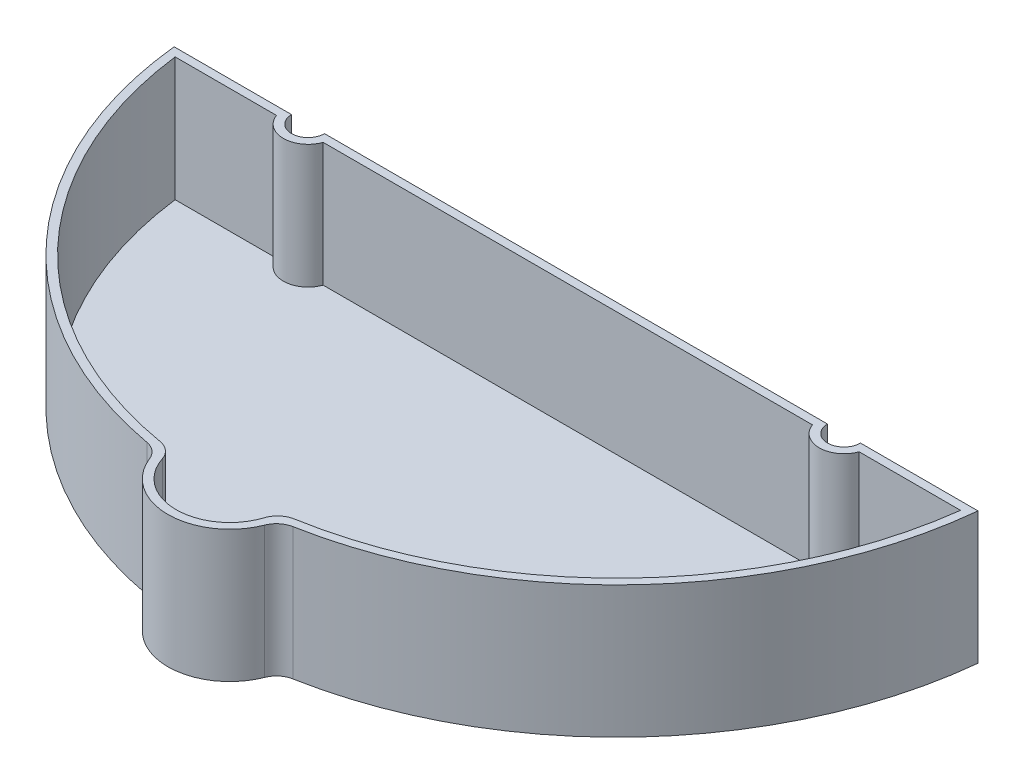
ISO-10303-21;
HEADER;
FILE_DESCRIPTION(('STEP AP214'),'2;1');
FILE_NAME('part.step','',(''),(''),'','','');
FILE_SCHEMA(('AUTOMOTIVE_DESIGN { 1 0 10303 214 1 1 1 1 }'));
ENDSEC;
DATA;
#1=APPLICATION_CONTEXT('core data for automotive mechanical design processes');
#2=APPLICATION_PROTOCOL_DEFINITION('international standard','automotive_design',2000,#1);
#3=PRODUCT_CONTEXT('',#1,'mechanical');
#4=PRODUCT('Part','Part','',(#3));
#5=PRODUCT_RELATED_PRODUCT_CATEGORY('part','',(#4));
#6=PRODUCT_DEFINITION_FORMATION('','',#4);
#7=PRODUCT_DEFINITION_CONTEXT('part definition',#1,'design');
#8=PRODUCT_DEFINITION('design','',#6,#7);
#9=PRODUCT_DEFINITION_SHAPE('','',#8);
#10=(LENGTH_UNIT() NAMED_UNIT(*) SI_UNIT(.MILLI.,.METRE.));
#11=(NAMED_UNIT(*) PLANE_ANGLE_UNIT() SI_UNIT($,.RADIAN.));
#12=(NAMED_UNIT(*) SI_UNIT($,.STERADIAN.) SOLID_ANGLE_UNIT());
#13=UNCERTAINTY_MEASURE_WITH_UNIT(LENGTH_MEASURE(1.E-05),#10,'distance_accuracy_value','');
#14=(GEOMETRIC_REPRESENTATION_CONTEXT(3) GLOBAL_UNCERTAINTY_ASSIGNED_CONTEXT((#13)) GLOBAL_UNIT_ASSIGNED_CONTEXT((#10,
#11,#12)) REPRESENTATION_CONTEXT('',''));
#15=CARTESIAN_POINT('',(0.,0.,0.));
#16=DIRECTION('',(0.,0.,1.));
#17=DIRECTION('',(1.,0.,0.));
#18=AXIS2_PLACEMENT_3D('',#15,#16,#17);
#19=CARTESIAN_POINT('',(65.,30.,-50.));
#20=DIRECTION('',(0.,-1.,0.));
#21=DIRECTION('',(0.,0.,-1.));
#22=AXIS2_PLACEMENT_3D('',#19,#20,#21);
#23=PLANE('',#22);
#24=CARTESIAN_POINT('',(65.,30.,-50.));
#25=DIRECTION('',(0.,-1.,0.));
#26=DIRECTION('',(0.,0.,-1.));
#27=AXIS2_PLACEMENT_3D('',#24,#25,#26);
#28=CIRCLE('',#27,4.);
#29=CARTESIAN_POINT('',(69.,30.,-50.));
#30=VERTEX_POINT('',#29);
#31=CARTESIAN_POINT('',(61.,30.,-50.));
#32=VERTEX_POINT('',#31);
#33=EDGE_CURVE('E232',#30,#32,#28,.T.);
#34=ORIENTED_EDGE('',*,*,#33,.T.);
#35=DIRECTION('',(-1.,0.,0.));
#36=VECTOR('',#35,1.);
#37=CARTESIAN_POINT('',(7.5,30.,-50.));
#38=LINE('',#37,#36);
#39=CARTESIAN_POINT('',(-61.,30.,-50.));
#40=VERTEX_POINT('',#39);
#41=EDGE_CURVE('E235',#32,#40,#38,.T.);
#42=ORIENTED_EDGE('',*,*,#41,.T.);
#43=CARTESIAN_POINT('',(-65.,30.,-50.));
#44=DIRECTION('',(0.,-1.,0.));
#45=DIRECTION('',(0.,0.,1.));
#46=AXIS2_PLACEMENT_3D('',#43,#44,#45);
#47=CIRCLE('',#46,4.);
#48=CARTESIAN_POINT('',(-69.,30.,-50.));
#49=VERTEX_POINT('',#48);
#50=EDGE_CURVE('E238',#40,#49,#47,.T.);
#51=ORIENTED_EDGE('',*,*,#50,.T.);
#52=DIRECTION('',(-1.,0.,0.));
#53=VECTOR('',#52,1.);
#54=CARTESIAN_POINT('',(-97.4884608556315,30.,-50.));
#55=LINE('',#54,#53);
#56=CARTESIAN_POINT('',(-97.4884608556315,30.,-50.));
#57=VERTEX_POINT('',#56);
#58=EDGE_CURVE('E240',#49,#57,#55,.T.);
#59=ORIENTED_EDGE('',*,*,#58,.T.);
#60=CARTESIAN_POINT('',(0.,30.,-60.));
#61=DIRECTION('',(0.,1.,0.));
#62=DIRECTION('',(0.,0.,1.));
#63=AXIS2_PLACEMENT_3D('',#60,#61,#62);
#64=CIRCLE('',#63,98.);
#65=CARTESIAN_POINT('',(-17.7150688006429,30.,36.3855608345383));
#66=VERTEX_POINT('',#65);
#67=EDGE_CURVE('E242',#57,#66,#64,.T.);
#68=ORIENTED_EDGE('',*,*,#67,.T.);
#69=CARTESIAN_POINT('',(-18.6188988414921,30.,41.3031914893617));
#70=DIRECTION('',(0.,-1.,0.));
#71=DIRECTION('',(0.,0.,-1.));
#72=AXIS2_PLACEMENT_3D('',#69,#70,#71);
#73=CIRCLE('',#72,5.);
#74=CARTESIAN_POINT('',(-13.9641741311191,30.,39.4773936170213));
#75=VERTEX_POINT('',#74);
#76=EDGE_CURVE('E11',#66,#75,#73,.T.);
#77=ORIENTED_EDGE('',*,*,#76,.T.);
#78=CARTESIAN_POINT('',(0.,30.,34.));
#79=DIRECTION('',(0.,1.,0.));
#80=DIRECTION('',(0.,0.,1.));
#81=AXIS2_PLACEMENT_3D('',#78,#79,#80);
#82=CIRCLE('',#81,15.);
#83=CARTESIAN_POINT('',(13.9641741311191,30.,39.4773936170213));
#84=VERTEX_POINT('',#83);
#85=EDGE_CURVE('E245',#75,#84,#82,.T.);
#86=ORIENTED_EDGE('',*,*,#85,.T.);
#87=CARTESIAN_POINT('',(18.6188988414921,30.,41.3031914893617));
#88=DIRECTION('',(0.,-1.,0.));
#89=DIRECTION('',(0.,0.,-1.));
#90=AXIS2_PLACEMENT_3D('',#87,#88,#89);
#91=CIRCLE('',#90,5.);
#92=CARTESIAN_POINT('',(17.715068800643,30.,36.3855608345383));
#93=VERTEX_POINT('',#92);
#94=EDGE_CURVE('E315',#84,#93,#91,.T.);
#95=ORIENTED_EDGE('',*,*,#94,.T.);
#96=CARTESIAN_POINT('',(0.,30.,-60.));
#97=DIRECTION('',(0.,1.,0.));
#98=DIRECTION('',(0.,0.,1.));
#99=AXIS2_PLACEMENT_3D('',#96,#97,#98);
#100=CIRCLE('',#99,98.);
#101=CARTESIAN_POINT('',(97.4884608556315,30.,-50.));
#102=VERTEX_POINT('',#101);
#103=EDGE_CURVE('E248',#93,#102,#100,.T.);
#104=ORIENTED_EDGE('',*,*,#103,.T.);
#105=DIRECTION('',(-1.,0.,0.));
#106=VECTOR('',#105,1.);
#107=CARTESIAN_POINT('',(69.,30.,-50.));
#108=LINE('',#107,#106);
#109=EDGE_CURVE('E250',#102,#30,#108,.T.);
#110=ORIENTED_EDGE('',*,*,#109,.T.);
#111=EDGE_LOOP('',(#34,#42,#51,#59,#68,#77,#86,#95,#104,#110));
#112=FACE_BOUND('',#111,.T.);
#113=CARTESIAN_POINT('',(0.,30.,-60.));
#114=DIRECTION('',(0.,-1.,0.));
#115=DIRECTION('',(0.,0.,-1.));
#116=AXIS2_PLACEMENT_3D('',#113,#114,#115);
#117=CIRCLE('',#116,96.);
#118=CARTESIAN_POINT('',(16.2792649615235,30.,34.6096481988624));
#119=VERTEX_POINT('',#118);
#120=CARTESIAN_POINT('',(95.2470471983253,30.,-48.));
#121=VERTEX_POINT('',#120);
#122=EDGE_CURVE('E228',#119,#121,#117,.F.);
#123=ORIENTED_EDGE('',*,*,#122,.F.);
#124=CARTESIAN_POINT('',(17.1271433449361,30.,39.5372340425532));
#125=DIRECTION('',(0.,-1.,0.));
#126=DIRECTION('',(0.,0.,-1.));
#127=AXIS2_PLACEMENT_3D('',#124,#125,#126);
#128=CIRCLE('',#127,5.);
#129=CARTESIAN_POINT('',(12.3696035268983,30.,37.9991134751773));
#130=VERTEX_POINT('',#129);
#131=EDGE_CURVE('E295',#119,#130,#128,.F.);
#132=ORIENTED_EDGE('',*,*,#131,.T.);
#133=CARTESIAN_POINT('',(0.,30.,34.));
#134=DIRECTION('',(0.,-1.,0.));
#135=DIRECTION('',(0.,0.,-1.));
#136=AXIS2_PLACEMENT_3D('',#133,#134,#135);
#137=CIRCLE('',#136,13.);
#138=CARTESIAN_POINT('',(-12.3696035268983,30.,37.9991134751773));
#139=VERTEX_POINT('',#138);
#140=EDGE_CURVE('E225',#139,#130,#137,.F.);
#141=ORIENTED_EDGE('',*,*,#140,.F.);
#142=CARTESIAN_POINT('',(-17.1271433449362,30.,39.5372340425532));
#143=DIRECTION('',(0.,-1.,0.));
#144=DIRECTION('',(0.,0.,-1.));
#145=AXIS2_PLACEMENT_3D('',#142,#143,#144);
#146=CIRCLE('',#145,5.);
#147=CARTESIAN_POINT('',(-16.2792649615235,30.,34.6096481988624));
#148=VERTEX_POINT('',#147);
#149=EDGE_CURVE('E293',#139,#148,#146,.F.);
#150=ORIENTED_EDGE('',*,*,#149,.T.);
#151=CARTESIAN_POINT('',(0.,30.,-60.));
#152=DIRECTION('',(0.,-1.,0.));
#153=DIRECTION('',(0.,0.,-1.));
#154=AXIS2_PLACEMENT_3D('',#151,#152,#153);
#155=CIRCLE('',#154,96.);
#156=CARTESIAN_POINT('',(-95.2470471983253,30.,-48.));
#157=VERTEX_POINT('',#156);
#158=EDGE_CURVE('E222',#157,#148,#155,.F.);
#159=ORIENTED_EDGE('',*,*,#158,.F.);
#160=DIRECTION('',(-1.,0.,0.));
#161=VECTOR('',#160,1.);
#162=CARTESIAN_POINT('',(65.,30.,-48.));
#163=LINE('',#162,#161);
#164=CARTESIAN_POINT('',(-70.6568542494924,30.,-48.));
#165=VERTEX_POINT('',#164);
#166=EDGE_CURVE('E220',#165,#157,#163,.T.);
#167=ORIENTED_EDGE('',*,*,#166,.F.);
#168=CARTESIAN_POINT('',(-65.,30.,-50.));
#169=DIRECTION('',(0.,-1.,0.));
#170=DIRECTION('',(0.,0.,-1.));
#171=AXIS2_PLACEMENT_3D('',#168,#169,#170);
#172=CIRCLE('',#171,6.);
#173=CARTESIAN_POINT('',(-59.3431457505076,30.,-48.));
#174=VERTEX_POINT('',#173);
#175=EDGE_CURVE('E218',#174,#165,#172,.T.);
#176=ORIENTED_EDGE('',*,*,#175,.F.);
#177=DIRECTION('',(-1.,0.,0.));
#178=VECTOR('',#177,1.);
#179=CARTESIAN_POINT('',(65.,30.,-48.));
#180=LINE('',#179,#178);
#181=CARTESIAN_POINT('',(59.3431457505076,30.,-48.));
#182=VERTEX_POINT('',#181);
#183=EDGE_CURVE('E184',#182,#174,#180,.T.);
#184=ORIENTED_EDGE('',*,*,#183,.F.);
#185=CARTESIAN_POINT('',(65.,30.,-50.));
#186=DIRECTION('',(0.,-1.,0.));
#187=DIRECTION('',(0.,0.,-1.));
#188=AXIS2_PLACEMENT_3D('',#185,#186,#187);
#189=CIRCLE('',#188,6.);
#190=CARTESIAN_POINT('',(70.6568542494924,30.,-48.));
#191=VERTEX_POINT('',#190);
#192=EDGE_CURVE('E215',#191,#182,#189,.T.);
#193=ORIENTED_EDGE('',*,*,#192,.F.);
#194=DIRECTION('',(-1.,0.,0.));
#195=VECTOR('',#194,1.);
#196=CARTESIAN_POINT('',(65.,30.,-48.));
#197=LINE('',#196,#195);
#198=EDGE_CURVE('E230',#121,#191,#197,.T.);
#199=ORIENTED_EDGE('',*,*,#198,.F.);
#200=EDGE_LOOP('',(#123,#132,#141,#150,#159,#167,#176,#184,#193,#199));
#201=FACE_BOUND('',#200,.T.);
#202=ADVANCED_FACE('F34',(#112,#201),#23,.F.);
#203=CARTESIAN_POINT('',(65.,30.,-50.));
#204=DIRECTION('',(0.,-1.,0.));
#205=DIRECTION('',(0.,0.,-1.));
#206=AXIS2_PLACEMENT_3D('',#203,#204,#205);
#207=CYLINDRICAL_SURFACE('',#206,4.);
#208=CARTESIAN_POINT('',(65.,-2.,-50.));
#209=DIRECTION('',(0.,-1.,0.));
#210=DIRECTION('',(0.,0.,-1.));
#211=AXIS2_PLACEMENT_3D('',#208,#209,#210);
#212=CIRCLE('',#211,4.);
#213=CARTESIAN_POINT('',(69.,-2.,-50.));
#214=VERTEX_POINT('',#213);
#215=CARTESIAN_POINT('',(61.,-2.,-50.));
#216=VERTEX_POINT('',#215);
#217=EDGE_CURVE('E253',#214,#216,#212,.T.);
#218=ORIENTED_EDGE('',*,*,#217,.T.);
#219=DIRECTION('',(0.,-1.,0.));
#220=VECTOR('',#219,1.);
#221=CARTESIAN_POINT('',(61.,30.,-50.));
#222=LINE('',#221,#220);
#223=EDGE_CURVE('E283',#32,#216,#222,.T.);
#224=ORIENTED_EDGE('',*,*,#223,.F.);
#225=ORIENTED_EDGE('',*,*,#33,.F.);
#226=DIRECTION('',(0.,-1.,0.));
#227=VECTOR('',#226,1.);
#228=CARTESIAN_POINT('',(69.,30.,-50.));
#229=LINE('',#228,#227);
#230=EDGE_CURVE('E252',#30,#214,#229,.T.);
#231=ORIENTED_EDGE('',*,*,#230,.T.);
#232=EDGE_LOOP('',(#218,#224,#225,#231));
#233=FACE_BOUND('',#232,.T.);
#234=ADVANCED_FACE('F349',(#233),#207,.F.);
#235=CARTESIAN_POINT('',(-61.,30.,-50.));
#236=DIRECTION('',(0.,0.,1.));
#237=DIRECTION('',(1.,0.,0.));
#238=AXIS2_PLACEMENT_3D('',#235,#236,#237);
#239=PLANE('',#238);
#240=DIRECTION('',(-1.,0.,0.));
#241=VECTOR('',#240,1.);
#242=CARTESIAN_POINT('',(-61.,-2.,-50.));
#243=LINE('',#242,#241);
#244=CARTESIAN_POINT('',(-61.,-2.,-50.));
#245=VERTEX_POINT('',#244);
#246=EDGE_CURVE('E256',#216,#245,#243,.T.);
#247=ORIENTED_EDGE('',*,*,#246,.T.);
#248=DIRECTION('',(0.,-1.,0.));
#249=VECTOR('',#248,1.);
#250=CARTESIAN_POINT('',(-61.,30.,-50.));
#251=LINE('',#250,#249);
#252=EDGE_CURVE('E280',#40,#245,#251,.T.);
#253=ORIENTED_EDGE('',*,*,#252,.F.);
#254=ORIENTED_EDGE('',*,*,#41,.F.);
#255=ORIENTED_EDGE('',*,*,#223,.T.);
#256=EDGE_LOOP('',(#247,#253,#254,#255));
#257=FACE_BOUND('',#256,.T.);
#258=ADVANCED_FACE('F353',(#257),#239,.F.);
#259=CARTESIAN_POINT('',(-65.,30.,-50.));
#260=DIRECTION('',(0.,-1.,0.));
#261=DIRECTION('',(0.,0.,-1.));
#262=AXIS2_PLACEMENT_3D('',#259,#260,#261);
#263=CYLINDRICAL_SURFACE('',#262,4.);
#264=CARTESIAN_POINT('',(-65.,-2.,-50.));
#265=DIRECTION('',(0.,-1.,0.));
#266=DIRECTION('',(0.,0.,1.));
#267=AXIS2_PLACEMENT_3D('',#264,#265,#266);
#268=CIRCLE('',#267,4.);
#269=CARTESIAN_POINT('',(-69.,-2.,-50.));
#270=VERTEX_POINT('',#269);
#271=EDGE_CURVE('E258',#245,#270,#268,.T.);
#272=ORIENTED_EDGE('',*,*,#271,.T.);
#273=DIRECTION('',(0.,-1.,0.));
#274=VECTOR('',#273,1.);
#275=CARTESIAN_POINT('',(-69.,30.,-50.));
#276=LINE('',#275,#274);
#277=EDGE_CURVE('E277',#49,#270,#276,.T.);
#278=ORIENTED_EDGE('',*,*,#277,.F.);
#279=ORIENTED_EDGE('',*,*,#50,.F.);
#280=ORIENTED_EDGE('',*,*,#252,.T.);
#281=EDGE_LOOP('',(#272,#278,#279,#280));
#282=FACE_BOUND('',#281,.T.);
#283=ADVANCED_FACE('F520',(#282),#263,.F.);
#284=CARTESIAN_POINT('',(-97.4884608556315,30.,-50.));
#285=DIRECTION('',(0.,0.,1.));
#286=DIRECTION('',(1.,0.,0.));
#287=AXIS2_PLACEMENT_3D('',#284,#285,#286);
#288=PLANE('',#287);
#289=DIRECTION('',(-1.,0.,0.));
#290=VECTOR('',#289,1.);
#291=CARTESIAN_POINT('',(-97.4884608556315,-2.,-50.));
#292=LINE('',#291,#290);
#293=CARTESIAN_POINT('',(-97.4884608556315,-2.,-50.));
#294=VERTEX_POINT('',#293);
#295=EDGE_CURVE('E260',#270,#294,#292,.T.);
#296=ORIENTED_EDGE('',*,*,#295,.T.);
#297=DIRECTION('',(0.,-1.,0.));
#298=VECTOR('',#297,1.);
#299=CARTESIAN_POINT('',(-97.4884608556315,30.,-50.));
#300=LINE('',#299,#298);
#301=EDGE_CURVE('E274',#57,#294,#300,.T.);
#302=ORIENTED_EDGE('',*,*,#301,.F.);
#303=ORIENTED_EDGE('',*,*,#58,.F.);
#304=ORIENTED_EDGE('',*,*,#277,.T.);
#305=EDGE_LOOP('',(#296,#302,#303,#304));
#306=FACE_BOUND('',#305,.T.);
#307=ADVANCED_FACE('F512',(#306),#288,.F.);
#308=CARTESIAN_POINT('',(0.,30.,-60.));
#309=DIRECTION('',(0.,-1.,0.));
#310=DIRECTION('',(0.,0.,-1.));
#311=AXIS2_PLACEMENT_3D('',#308,#309,#310);
#312=CYLINDRICAL_SURFACE('',#311,98.);
#313=CARTESIAN_POINT('',(0.,-2.,-60.));
#314=DIRECTION('',(0.,1.,0.));
#315=DIRECTION('',(0.,0.,1.));
#316=AXIS2_PLACEMENT_3D('',#313,#314,#315);
#317=CIRCLE('',#316,98.);
#318=CARTESIAN_POINT('',(-17.7150688006429,-2.,36.3855608345383));
#319=VERTEX_POINT('',#318);
#320=EDGE_CURVE('E262',#294,#319,#317,.T.);
#321=ORIENTED_EDGE('',*,*,#320,.T.);
#322=DIRECTION('',(0.,-1.,0.));
#323=VECTOR('',#322,1.);
#324=CARTESIAN_POINT('',(-17.7150688006429,30.,36.3855608345383));
#325=LINE('',#324,#323);
#326=EDGE_CURVE('E308',#319,#66,#325,.F.);
#327=ORIENTED_EDGE('',*,*,#326,.T.);
#328=ORIENTED_EDGE('',*,*,#67,.F.);
#329=ORIENTED_EDGE('',*,*,#301,.T.);
#330=EDGE_LOOP('',(#321,#327,#328,#329));
#331=FACE_BOUND('',#330,.T.);
#332=ADVANCED_FACE('F505',(#331),#312,.T.);
#333=CARTESIAN_POINT('',(0.,30.,34.));
#334=DIRECTION('',(0.,-1.,0.));
#335=DIRECTION('',(0.,0.,-1.));
#336=AXIS2_PLACEMENT_3D('',#333,#334,#335);
#337=CYLINDRICAL_SURFACE('',#336,15.);
#338=CARTESIAN_POINT('',(0.,-2.,34.));
#339=DIRECTION('',(0.,1.,0.));
#340=DIRECTION('',(0.,0.,1.));
#341=AXIS2_PLACEMENT_3D('',#338,#339,#340);
#342=CIRCLE('',#341,15.);
#343=CARTESIAN_POINT('',(-13.9641741311191,-2.,39.4773936170213));
#344=VERTEX_POINT('',#343);
#345=CARTESIAN_POINT('',(13.9641741311191,-2.,39.4773936170213));
#346=VERTEX_POINT('',#345);
#347=EDGE_CURVE('E264',#344,#346,#342,.T.);
#348=ORIENTED_EDGE('',*,*,#347,.T.);
#349=DIRECTION('',(0.,-1.,0.));
#350=VECTOR('',#349,1.);
#351=CARTESIAN_POINT('',(13.9641741311191,30.,39.4773936170213));
#352=LINE('',#351,#350);
#353=EDGE_CURVE('E306',#346,#84,#352,.F.);
#354=ORIENTED_EDGE('',*,*,#353,.T.);
#355=ORIENTED_EDGE('',*,*,#85,.F.);
#356=DIRECTION('',(0.,-1.,0.));
#357=VECTOR('',#356,1.);
#358=CARTESIAN_POINT('',(-13.9641741311191,30.,39.4773936170213));
#359=LINE('',#358,#357);
#360=EDGE_CURVE('E303',#75,#344,#359,.T.);
#361=ORIENTED_EDGE('',*,*,#360,.T.);
#362=EDGE_LOOP('',(#348,#354,#355,#361));
#363=FACE_BOUND('',#362,.T.);
#364=ADVANCED_FACE('F330',(#363),#337,.T.);
#365=CARTESIAN_POINT('',(0.,30.,-60.));
#366=DIRECTION('',(0.,-1.,0.));
#367=DIRECTION('',(0.,0.,-1.));
#368=AXIS2_PLACEMENT_3D('',#365,#366,#367);
#369=CYLINDRICAL_SURFACE('',#368,98.);
#370=ORIENTED_EDGE('',*,*,#103,.F.);
#371=DIRECTION('',(0.,-1.,0.));
#372=VECTOR('',#371,1.);
#373=CARTESIAN_POINT('',(17.715068800643,30.,36.3855608345383));
#374=LINE('',#373,#372);
#375=CARTESIAN_POINT('',(17.715068800643,-2.,36.3855608345383));
#376=VERTEX_POINT('',#375);
#377=EDGE_CURVE('E300',#93,#376,#374,.T.);
#378=ORIENTED_EDGE('',*,*,#377,.T.);
#379=CARTESIAN_POINT('',(0.,-2.,-60.));
#380=DIRECTION('',(0.,1.,0.));
#381=DIRECTION('',(0.,0.,1.));
#382=AXIS2_PLACEMENT_3D('',#379,#380,#381);
#383=CIRCLE('',#382,98.);
#384=CARTESIAN_POINT('',(97.4884608556315,-2.,-50.));
#385=VERTEX_POINT('',#384);
#386=EDGE_CURVE('E266',#376,#385,#383,.T.);
#387=ORIENTED_EDGE('',*,*,#386,.T.);
#388=DIRECTION('',(0.,-1.,0.));
#389=VECTOR('',#388,1.);
#390=CARTESIAN_POINT('',(97.4884608556315,30.,-50.));
#391=LINE('',#390,#389);
#392=EDGE_CURVE('E271',#102,#385,#391,.T.);
#393=ORIENTED_EDGE('',*,*,#392,.F.);
#394=EDGE_LOOP('',(#370,#378,#387,#393));
#395=FACE_BOUND('',#394,.T.);
#396=ADVANCED_FACE('F326',(#395),#369,.T.);
#397=CARTESIAN_POINT('',(69.,30.,-50.));
#398=DIRECTION('',(0.,0.,1.));
#399=DIRECTION('',(1.,0.,0.));
#400=AXIS2_PLACEMENT_3D('',#397,#398,#399);
#401=PLANE('',#400);
#402=DIRECTION('',(-1.,0.,0.));
#403=VECTOR('',#402,1.);
#404=CARTESIAN_POINT('',(69.,-2.,-50.));
#405=LINE('',#404,#403);
#406=EDGE_CURVE('E236',#385,#214,#405,.T.);
#407=ORIENTED_EDGE('',*,*,#406,.T.);
#408=ORIENTED_EDGE('',*,*,#230,.F.);
#409=ORIENTED_EDGE('',*,*,#109,.F.);
#410=ORIENTED_EDGE('',*,*,#392,.T.);
#411=EDGE_LOOP('',(#407,#408,#409,#410));
#412=FACE_BOUND('',#411,.T.);
#413=ADVANCED_FACE('F337',(#412),#401,.F.);
#414=CARTESIAN_POINT('',(65.,-2.,-50.));
#415=DIRECTION('',(0.,-1.,0.));
#416=DIRECTION('',(0.,0.,-1.));
#417=AXIS2_PLACEMENT_3D('',#414,#415,#416);
#418=PLANE('',#417);
#419=ORIENTED_EDGE('',*,*,#217,.F.);
#420=ORIENTED_EDGE('',*,*,#406,.F.);
#421=ORIENTED_EDGE('',*,*,#386,.F.);
#422=CARTESIAN_POINT('',(18.6188988414921,-2.,41.3031914893617));
#423=DIRECTION('',(0.,-1.,0.));
#424=DIRECTION('',(0.,0.,-1.));
#425=AXIS2_PLACEMENT_3D('',#422,#423,#424);
#426=CIRCLE('',#425,5.);
#427=EDGE_CURVE('E54',#376,#346,#426,.F.);
#428=ORIENTED_EDGE('',*,*,#427,.T.);
#429=ORIENTED_EDGE('',*,*,#347,.F.);
#430=CARTESIAN_POINT('',(-18.6188988414921,-2.,41.3031914893617));
#431=DIRECTION('',(0.,-1.,0.));
#432=DIRECTION('',(0.,0.,-1.));
#433=AXIS2_PLACEMENT_3D('',#430,#431,#432);
#434=CIRCLE('',#433,5.);
#435=EDGE_CURVE('E42',#344,#319,#434,.F.);
#436=ORIENTED_EDGE('',*,*,#435,.T.);
#437=ORIENTED_EDGE('',*,*,#320,.F.);
#438=ORIENTED_EDGE('',*,*,#295,.F.);
#439=ORIENTED_EDGE('',*,*,#271,.F.);
#440=ORIENTED_EDGE('',*,*,#246,.F.);
#441=EDGE_LOOP('',(#419,#420,#421,#428,#429,#436,#437,#438,#439,#440));
#442=FACE_BOUND('',#441,.T.);
#443=ADVANCED_FACE('F333',(#442),#418,.T.);
#444=CARTESIAN_POINT('',(65.,30.,-50.));
#445=DIRECTION('',(0.,-1.,0.));
#446=DIRECTION('',(0.,0.,-1.));
#447=AXIS2_PLACEMENT_3D('',#444,#445,#446);
#448=CYLINDRICAL_SURFACE('',#447,6.);
#449=CARTESIAN_POINT('',(65.,0.,-50.));
#450=DIRECTION('',(0.,-1.,0.));
#451=DIRECTION('',(0.,0.,-1.));
#452=AXIS2_PLACEMENT_3D('',#449,#450,#451);
#453=CIRCLE('',#452,6.);
#454=CARTESIAN_POINT('',(70.6568542494924,0.,-48.));
#455=VERTEX_POINT('',#454);
#456=CARTESIAN_POINT('',(59.3431457505076,0.,-48.));
#457=VERTEX_POINT('',#456);
#458=EDGE_CURVE('E175',#455,#457,#453,.T.);
#459=ORIENTED_EDGE('',*,*,#458,.F.);
#460=DIRECTION('',(0.,-1.,0.));
#461=VECTOR('',#460,1.);
#462=CARTESIAN_POINT('',(70.6568542494924,30.,-48.));
#463=LINE('',#462,#461);
#464=EDGE_CURVE('E213',#191,#455,#463,.T.);
#465=ORIENTED_EDGE('',*,*,#464,.F.);
#466=ORIENTED_EDGE('',*,*,#192,.T.);
#467=DIRECTION('',(0.,-1.,0.));
#468=VECTOR('',#467,1.);
#469=CARTESIAN_POINT('',(59.3431457505076,30.,-48.));
#470=LINE('',#469,#468);
#471=EDGE_CURVE('E187',#182,#457,#470,.T.);
#472=ORIENTED_EDGE('',*,*,#471,.T.);
#473=EDGE_LOOP('',(#459,#465,#466,#472));
#474=FACE_BOUND('',#473,.T.);
#475=ADVANCED_FACE('F336',(#474),#448,.T.);
#476=CARTESIAN_POINT('',(-61.,30.,-48.));
#477=DIRECTION('',(0.,0.,1.));
#478=DIRECTION('',(1.,0.,0.));
#479=AXIS2_PLACEMENT_3D('',#476,#477,#478);
#480=PLANE('',#479);
#481=DIRECTION('',(-1.,0.,0.));
#482=VECTOR('',#481,1.);
#483=CARTESIAN_POINT('',(65.,0.,-48.));
#484=LINE('',#483,#482);
#485=CARTESIAN_POINT('',(-59.3431457505076,0.,-48.));
#486=VERTEX_POINT('',#485);
#487=EDGE_CURVE('E168',#457,#486,#484,.T.);
#488=ORIENTED_EDGE('',*,*,#487,.F.);
#489=ORIENTED_EDGE('',*,*,#471,.F.);
#490=ORIENTED_EDGE('',*,*,#183,.T.);
#491=DIRECTION('',(0.,-1.,0.));
#492=VECTOR('',#491,1.);
#493=CARTESIAN_POINT('',(-59.3431457505076,30.,-48.));
#494=LINE('',#493,#492);
#495=EDGE_CURVE('E181',#174,#486,#494,.T.);
#496=ORIENTED_EDGE('',*,*,#495,.T.);
#497=EDGE_LOOP('',(#488,#489,#490,#496));
#498=FACE_BOUND('',#497,.T.);
#499=ADVANCED_FACE('F182',(#498),#480,.T.);
#500=CARTESIAN_POINT('',(-65.,30.,-50.));
#501=DIRECTION('',(0.,-1.,0.));
#502=DIRECTION('',(0.,0.,-1.));
#503=AXIS2_PLACEMENT_3D('',#500,#501,#502);
#504=CYLINDRICAL_SURFACE('',#503,6.);
#505=CARTESIAN_POINT('',(-65.,0.,-50.));
#506=DIRECTION('',(0.,-1.,0.));
#507=DIRECTION('',(0.,0.,-1.));
#508=AXIS2_PLACEMENT_3D('',#505,#506,#507);
#509=CIRCLE('',#508,6.);
#510=CARTESIAN_POINT('',(-70.6568542494924,0.,-48.));
#511=VERTEX_POINT('',#510);
#512=EDGE_CURVE('E172',#486,#511,#509,.T.);
#513=ORIENTED_EDGE('',*,*,#512,.F.);
#514=ORIENTED_EDGE('',*,*,#495,.F.);
#515=ORIENTED_EDGE('',*,*,#175,.T.);
#516=DIRECTION('',(0.,-1.,0.));
#517=VECTOR('',#516,1.);
#518=CARTESIAN_POINT('',(-70.6568542494924,30.,-48.));
#519=LINE('',#518,#517);
#520=EDGE_CURVE('E188',#165,#511,#519,.T.);
#521=ORIENTED_EDGE('',*,*,#520,.T.);
#522=EDGE_LOOP('',(#513,#514,#515,#521));
#523=FACE_BOUND('',#522,.T.);
#524=ADVANCED_FACE('F190',(#523),#504,.T.);
#525=CARTESIAN_POINT('',(-97.4884608556315,30.,-48.));
#526=DIRECTION('',(0.,0.,1.));
#527=DIRECTION('',(1.,0.,0.));
#528=AXIS2_PLACEMENT_3D('',#525,#526,#527);
#529=PLANE('',#528);
#530=DIRECTION('',(-1.,0.,0.));
#531=VECTOR('',#530,1.);
#532=CARTESIAN_POINT('',(65.,0.,-48.));
#533=LINE('',#532,#531);
#534=CARTESIAN_POINT('',(-95.2470471983253,0.,-48.));
#535=VERTEX_POINT('',#534);
#536=EDGE_CURVE('E193',#511,#535,#533,.T.);
#537=ORIENTED_EDGE('',*,*,#536,.F.);
#538=ORIENTED_EDGE('',*,*,#520,.F.);
#539=ORIENTED_EDGE('',*,*,#166,.T.);
#540=DIRECTION('',(0.,-1.,0.));
#541=VECTOR('',#540,1.);
#542=CARTESIAN_POINT('',(-95.2470471983253,30.,-48.));
#543=LINE('',#542,#541);
#544=EDGE_CURVE('E198',#157,#535,#543,.T.);
#545=ORIENTED_EDGE('',*,*,#544,.T.);
#546=EDGE_LOOP('',(#537,#538,#539,#545));
#547=FACE_BOUND('',#546,.T.);
#548=ADVANCED_FACE('F375',(#547),#529,.T.);
#549=CARTESIAN_POINT('',(0.,30.,-60.));
#550=DIRECTION('',(0.,-1.,0.));
#551=DIRECTION('',(0.,0.,-1.));
#552=AXIS2_PLACEMENT_3D('',#549,#550,#551);
#553=CYLINDRICAL_SURFACE('',#552,96.);
#554=ORIENTED_EDGE('',*,*,#158,.T.);
#555=DIRECTION('',(0.,-1.,0.));
#556=VECTOR('',#555,1.);
#557=CARTESIAN_POINT('',(-16.2792649615235,30.,34.6096481988624));
#558=LINE('',#557,#556);
#559=CARTESIAN_POINT('',(-16.2792649615235,0.,34.6096481988624));
#560=VERTEX_POINT('',#559);
#561=EDGE_CURVE('E297',#148,#560,#558,.T.);
#562=ORIENTED_EDGE('',*,*,#561,.T.);
#563=CARTESIAN_POINT('',(0.,0.,-60.));
#564=DIRECTION('',(0.,-1.,0.));
#565=DIRECTION('',(0.,0.,-1.));
#566=AXIS2_PLACEMENT_3D('',#563,#564,#565);
#567=CIRCLE('',#566,96.);
#568=EDGE_CURVE('E195',#535,#560,#567,.F.);
#569=ORIENTED_EDGE('',*,*,#568,.F.);
#570=ORIENTED_EDGE('',*,*,#544,.F.);
#571=EDGE_LOOP('',(#554,#562,#569,#570));
#572=FACE_BOUND('',#571,.T.);
#573=ADVANCED_FACE('F371',(#572),#553,.F.);
#574=CARTESIAN_POINT('',(0.,30.,34.));
#575=DIRECTION('',(0.,-1.,0.));
#576=DIRECTION('',(0.,0.,-1.));
#577=AXIS2_PLACEMENT_3D('',#574,#575,#576);
#578=CYLINDRICAL_SURFACE('',#577,13.);
#579=ORIENTED_EDGE('',*,*,#140,.T.);
#580=DIRECTION('',(0.,-1.,0.));
#581=VECTOR('',#580,1.);
#582=CARTESIAN_POINT('',(12.3696035268983,30.,37.9991134751773));
#583=LINE('',#582,#581);
#584=CARTESIAN_POINT('',(12.3696035268983,0.,37.9991134751773));
#585=VERTEX_POINT('',#584);
#586=EDGE_CURVE('E288',#130,#585,#583,.T.);
#587=ORIENTED_EDGE('',*,*,#586,.T.);
#588=CARTESIAN_POINT('',(0.,0.,34.));
#589=DIRECTION('',(0.,-1.,0.));
#590=DIRECTION('',(0.,0.,-1.));
#591=AXIS2_PLACEMENT_3D('',#588,#589,#590);
#592=CIRCLE('',#591,13.);
#593=CARTESIAN_POINT('',(-12.3696035268983,0.,37.9991134751773));
#594=VERTEX_POINT('',#593);
#595=EDGE_CURVE('E205',#594,#585,#592,.F.);
#596=ORIENTED_EDGE('',*,*,#595,.F.);
#597=DIRECTION('',(0.,-1.,0.));
#598=VECTOR('',#597,1.);
#599=CARTESIAN_POINT('',(-12.3696035268983,30.,37.9991134751773));
#600=LINE('',#599,#598);
#601=EDGE_CURVE('E286',#594,#139,#600,.F.);
#602=ORIENTED_EDGE('',*,*,#601,.T.);
#603=EDGE_LOOP('',(#579,#587,#596,#602));
#604=FACE_BOUND('',#603,.T.);
#605=ADVANCED_FACE('F367',(#604),#578,.F.);
#606=CARTESIAN_POINT('',(0.,30.,-60.));
#607=DIRECTION('',(0.,-1.,0.));
#608=DIRECTION('',(0.,0.,-1.));
#609=AXIS2_PLACEMENT_3D('',#606,#607,#608);
#610=CYLINDRICAL_SURFACE('',#609,96.);
#611=CARTESIAN_POINT('',(0.,0.,-60.));
#612=DIRECTION('',(0.,-1.,0.));
#613=DIRECTION('',(0.,0.,-1.));
#614=AXIS2_PLACEMENT_3D('',#611,#612,#613);
#615=CIRCLE('',#614,96.);
#616=CARTESIAN_POINT('',(16.2792649615235,0.,34.6096481988624));
#617=VERTEX_POINT('',#616);
#618=CARTESIAN_POINT('',(95.2470471983253,0.,-48.));
#619=VERTEX_POINT('',#618);
#620=EDGE_CURVE('E208',#617,#619,#615,.F.);
#621=ORIENTED_EDGE('',*,*,#620,.F.);
#622=DIRECTION('',(0.,-1.,0.));
#623=VECTOR('',#622,1.);
#624=CARTESIAN_POINT('',(16.2792649615235,30.,34.6096481988624));
#625=LINE('',#624,#623);
#626=EDGE_CURVE('E291',#617,#119,#625,.F.);
#627=ORIENTED_EDGE('',*,*,#626,.T.);
#628=ORIENTED_EDGE('',*,*,#122,.T.);
#629=DIRECTION('',(0.,-1.,0.));
#630=VECTOR('',#629,1.);
#631=CARTESIAN_POINT('',(95.2470471983253,30.,-48.));
#632=LINE('',#631,#630);
#633=EDGE_CURVE('E202',#121,#619,#632,.T.);
#634=ORIENTED_EDGE('',*,*,#633,.T.);
#635=EDGE_LOOP('',(#621,#627,#628,#634));
#636=FACE_BOUND('',#635,.T.);
#637=ADVANCED_FACE('F363',(#636),#610,.F.);
#638=CARTESIAN_POINT('',(69.,30.,-48.));
#639=DIRECTION('',(0.,0.,1.));
#640=DIRECTION('',(1.,0.,0.));
#641=AXIS2_PLACEMENT_3D('',#638,#639,#640);
#642=PLANE('',#641);
#643=DIRECTION('',(-1.,0.,0.));
#644=VECTOR('',#643,1.);
#645=CARTESIAN_POINT('',(65.,0.,-48.));
#646=LINE('',#645,#644);
#647=EDGE_CURVE('E210',#619,#455,#646,.T.);
#648=ORIENTED_EDGE('',*,*,#647,.F.);
#649=ORIENTED_EDGE('',*,*,#633,.F.);
#650=ORIENTED_EDGE('',*,*,#198,.T.);
#651=ORIENTED_EDGE('',*,*,#464,.T.);
#652=EDGE_LOOP('',(#648,#649,#650,#651));
#653=FACE_BOUND('',#652,.T.);
#654=ADVANCED_FACE('F360',(#653),#642,.T.);
#655=CARTESIAN_POINT('',(65.,0.,-50.));
#656=DIRECTION('',(0.,-1.,0.));
#657=DIRECTION('',(0.,0.,-1.));
#658=AXIS2_PLACEMENT_3D('',#655,#656,#657);
#659=PLANE('',#658);
#660=ORIENTED_EDGE('',*,*,#458,.T.);
#661=ORIENTED_EDGE('',*,*,#487,.T.);
#662=ORIENTED_EDGE('',*,*,#512,.T.);
#663=ORIENTED_EDGE('',*,*,#536,.T.);
#664=ORIENTED_EDGE('',*,*,#568,.T.);
#665=CARTESIAN_POINT('',(-17.1271433449362,0.,39.5372340425532));
#666=DIRECTION('',(0.,-1.,0.));
#667=DIRECTION('',(0.,0.,-1.));
#668=AXIS2_PLACEMENT_3D('',#665,#666,#667);
#669=CIRCLE('',#668,5.);
#670=EDGE_CURVE('E312',#560,#594,#669,.T.);
#671=ORIENTED_EDGE('',*,*,#670,.T.);
#672=ORIENTED_EDGE('',*,*,#595,.T.);
#673=CARTESIAN_POINT('',(17.1271433449361,0.,39.5372340425532));
#674=DIRECTION('',(0.,-1.,0.));
#675=DIRECTION('',(0.,0.,-1.));
#676=AXIS2_PLACEMENT_3D('',#673,#674,#675);
#677=CIRCLE('',#676,5.);
#678=EDGE_CURVE('E310',#585,#617,#677,.T.);
#679=ORIENTED_EDGE('',*,*,#678,.T.);
#680=ORIENTED_EDGE('',*,*,#620,.T.);
#681=ORIENTED_EDGE('',*,*,#647,.T.);
#682=EDGE_LOOP('',(#660,#661,#662,#663,#664,#671,#672,#679,#680,#681));
#683=FACE_BOUND('',#682,.T.);
#684=ADVANCED_FACE('F170',(#683),#659,.F.);
#685=CARTESIAN_POINT('',(17.1271433449361,30.,39.5372340425532));
#686=DIRECTION('',(0.,-1.,0.));
#687=DIRECTION('',(0.,0.,-1.));
#688=AXIS2_PLACEMENT_3D('',#685,#686,#687);
#689=CYLINDRICAL_SURFACE('',#688,5.);
#690=ORIENTED_EDGE('',*,*,#131,.F.);
#691=ORIENTED_EDGE('',*,*,#626,.F.);
#692=ORIENTED_EDGE('',*,*,#678,.F.);
#693=ORIENTED_EDGE('',*,*,#586,.F.);
#694=EDGE_LOOP('',(#690,#691,#692,#693));
#695=FACE_BOUND('',#694,.T.);
#696=ADVANCED_FACE('F359',(#695),#689,.T.);
#697=CARTESIAN_POINT('',(-17.1271433449362,30.,39.5372340425532));
#698=DIRECTION('',(0.,-1.,0.));
#699=DIRECTION('',(0.,0.,-1.));
#700=AXIS2_PLACEMENT_3D('',#697,#698,#699);
#701=CYLINDRICAL_SURFACE('',#700,5.);
#702=ORIENTED_EDGE('',*,*,#149,.F.);
#703=ORIENTED_EDGE('',*,*,#601,.F.);
#704=ORIENTED_EDGE('',*,*,#670,.F.);
#705=ORIENTED_EDGE('',*,*,#561,.F.);
#706=EDGE_LOOP('',(#702,#703,#704,#705));
#707=FACE_BOUND('',#706,.T.);
#708=ADVANCED_FACE('F421',(#707),#701,.T.);
#709=CARTESIAN_POINT('',(18.6188988414921,30.,41.3031914893617));
#710=DIRECTION('',(0.,1.,0.));
#711=DIRECTION('',(0.,0.,1.));
#712=AXIS2_PLACEMENT_3D('',#709,#710,#711);
#713=CYLINDRICAL_SURFACE('',#712,5.);
#714=ORIENTED_EDGE('',*,*,#94,.F.);
#715=ORIENTED_EDGE('',*,*,#353,.F.);
#716=ORIENTED_EDGE('',*,*,#427,.F.);
#717=ORIENTED_EDGE('',*,*,#377,.F.);
#718=EDGE_LOOP('',(#714,#715,#716,#717));
#719=FACE_BOUND('',#718,.T.);
#720=ADVANCED_FACE('F328',(#719),#713,.F.);
#721=CARTESIAN_POINT('',(-18.6188988414921,30.,41.3031914893617));
#722=DIRECTION('',(0.,1.,0.));
#723=DIRECTION('',(0.,0.,1.));
#724=AXIS2_PLACEMENT_3D('',#721,#722,#723);
#725=CYLINDRICAL_SURFACE('',#724,5.);
#726=ORIENTED_EDGE('',*,*,#76,.F.);
#727=ORIENTED_EDGE('',*,*,#326,.F.);
#728=ORIENTED_EDGE('',*,*,#435,.F.);
#729=ORIENTED_EDGE('',*,*,#360,.F.);
#730=EDGE_LOOP('',(#726,#727,#728,#729));
#731=FACE_BOUND('',#730,.T.);
#732=ADVANCED_FACE('F36',(#731),#725,.F.);
#733=CLOSED_SHELL('',(#202,#234,#258,#283,#307,#332,#364,#396,#413,#443,#475,#499,#524,#548,
#573,#605,#637,#654,#684,#696,#708,#720,#732));
#734=MANIFOLD_SOLID_BREP('B2',#733);
#735=ADVANCED_BREP_SHAPE_REPRESENTATION('',(#18,#734),#14);
#736=SHAPE_DEFINITION_REPRESENTATION(#9,#735);
ENDSEC;
END-ISO-10303-21;
